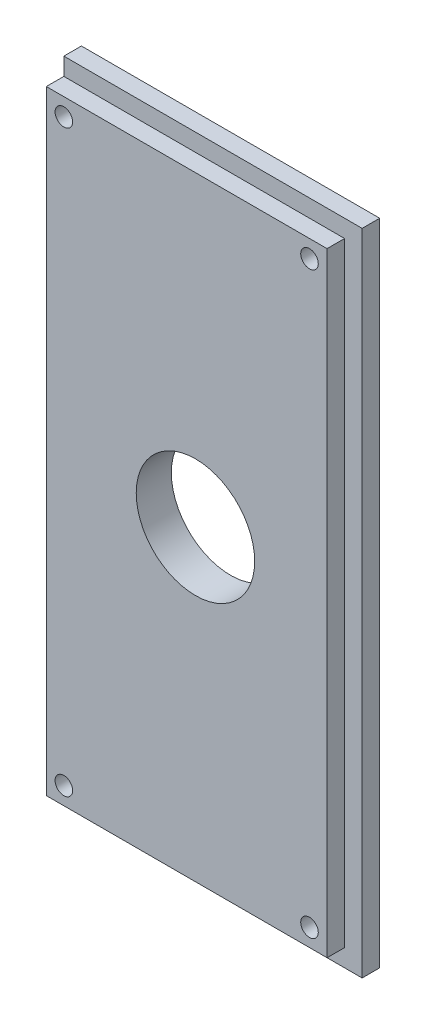
ISO-10303-21;
HEADER;
FILE_DESCRIPTION(('STEP AP214'),'2;1');
FILE_NAME('part.step','',(''),(''),'','','');
FILE_SCHEMA(('AUTOMOTIVE_DESIGN { 1 0 10303 214 1 1 1 1 }'));
ENDSEC;
DATA;
#1=APPLICATION_CONTEXT('core data for automotive mechanical design processes');
#2=APPLICATION_PROTOCOL_DEFINITION('international standard','automotive_design',2000,#1);
#3=PRODUCT_CONTEXT('',#1,'mechanical');
#4=PRODUCT('Part','Part','',(#3));
#5=PRODUCT_RELATED_PRODUCT_CATEGORY('part','',(#4));
#6=PRODUCT_DEFINITION_FORMATION('','',#4);
#7=PRODUCT_DEFINITION_CONTEXT('part definition',#1,'design');
#8=PRODUCT_DEFINITION('design','',#6,#7);
#9=PRODUCT_DEFINITION_SHAPE('','',#8);
#10=(LENGTH_UNIT() NAMED_UNIT(*) SI_UNIT(.MILLI.,.METRE.));
#11=(NAMED_UNIT(*) PLANE_ANGLE_UNIT() SI_UNIT($,.RADIAN.));
#12=(NAMED_UNIT(*) SI_UNIT($,.STERADIAN.) SOLID_ANGLE_UNIT());
#13=UNCERTAINTY_MEASURE_WITH_UNIT(LENGTH_MEASURE(1.E-05),#10,'distance_accuracy_value','');
#14=(GEOMETRIC_REPRESENTATION_CONTEXT(3) GLOBAL_UNCERTAINTY_ASSIGNED_CONTEXT((#13)) GLOBAL_UNIT_ASSIGNED_CONTEXT((#10,
#11,#12)) REPRESENTATION_CONTEXT('',''));
#15=CARTESIAN_POINT('',(0.,0.,0.));
#16=DIRECTION('',(0.,0.,1.));
#17=DIRECTION('',(1.,0.,0.));
#18=AXIS2_PLACEMENT_3D('',#15,#16,#17);
#19=CARTESIAN_POINT('',(0.,0.,0.));
#20=DIRECTION('',(0.,0.,1.));
#21=DIRECTION('',(1.,0.,0.));
#22=AXIS2_PLACEMENT_3D('',#19,#20,#21);
#23=PLANE('',#22);
#24=CARTESIAN_POINT('',(0.,0.,0.));
#25=DIRECTION('',(0.,0.,-1.));
#26=DIRECTION('',(-1.,0.,0.));
#27=AXIS2_PLACEMENT_3D('',#24,#25,#26);
#28=CIRCLE('',#27,6.75);
#29=CARTESIAN_POINT('',(-6.75,0.,0.));
#30=VERTEX_POINT('',#29);
#31=EDGE_CURVE('E214',#30,#30,#28,.T.);
#32=ORIENTED_EDGE('',*,*,#31,.F.);
#33=EDGE_LOOP('',(#32));
#34=FACE_BOUND('',#33,.T.);
#35=CARTESIAN_POINT('',(-15.,33.,0.));
#36=DIRECTION('',(0.,0.,1.));
#37=DIRECTION('',(1.,0.,0.));
#38=AXIS2_PLACEMENT_3D('',#35,#36,#37);
#39=CIRCLE('',#38,1.);
#40=CARTESIAN_POINT('',(-14.,33.,0.));
#41=VERTEX_POINT('',#40);
#42=EDGE_CURVE('E211',#41,#41,#39,.T.);
#43=ORIENTED_EDGE('',*,*,#42,.T.);
#44=EDGE_LOOP('',(#43));
#45=FACE_BOUND('',#44,.T.);
#46=CARTESIAN_POINT('',(13.,33.,0.));
#47=DIRECTION('',(0.,0.,1.));
#48=DIRECTION('',(1.,0.,0.));
#49=AXIS2_PLACEMENT_3D('',#46,#47,#48);
#50=CIRCLE('',#49,1.);
#51=CARTESIAN_POINT('',(14.,33.,0.));
#52=VERTEX_POINT('',#51);
#53=EDGE_CURVE('E193',#52,#52,#50,.T.);
#54=ORIENTED_EDGE('',*,*,#53,.T.);
#55=EDGE_LOOP('',(#54));
#56=FACE_BOUND('',#55,.T.);
#57=CARTESIAN_POINT('',(13.,-33.,0.));
#58=DIRECTION('',(0.,0.,1.));
#59=DIRECTION('',(1.,0.,0.));
#60=AXIS2_PLACEMENT_3D('',#57,#58,#59);
#61=CIRCLE('',#60,1.);
#62=CARTESIAN_POINT('',(14.,-33.,0.));
#63=VERTEX_POINT('',#62);
#64=EDGE_CURVE('E200',#63,#63,#61,.T.);
#65=ORIENTED_EDGE('',*,*,#64,.T.);
#66=EDGE_LOOP('',(#65));
#67=FACE_BOUND('',#66,.T.);
#68=CARTESIAN_POINT('',(-15.,-33.,0.));
#69=DIRECTION('',(0.,0.,1.));
#70=DIRECTION('',(1.,0.,0.));
#71=AXIS2_PLACEMENT_3D('',#68,#69,#70);
#72=CIRCLE('',#71,1.);
#73=CARTESIAN_POINT('',(-14.,-33.,0.));
#74=VERTEX_POINT('',#73);
#75=EDGE_CURVE('E206',#74,#74,#72,.T.);
#76=ORIENTED_EDGE('',*,*,#75,.T.);
#77=EDGE_LOOP('',(#76));
#78=FACE_BOUND('',#77,.T.);
#79=DIRECTION('',(0.,-1.,0.));
#80=VECTOR('',#79,1.);
#81=CARTESIAN_POINT('',(-17.,37.,0.));
#82=LINE('',#81,#80);
#83=CARTESIAN_POINT('',(-17.,-7.,0.));
#84=VERTEX_POINT('',#83);
#85=CARTESIAN_POINT('',(-17.,-37.,0.));
#86=VERTEX_POINT('',#85);
#87=EDGE_CURVE('E305',#84,#86,#82,.T.);
#88=ORIENTED_EDGE('',*,*,#87,.F.);
#89=DIRECTION('',(-1.,0.,0.));
#90=VECTOR('',#89,1.);
#91=CARTESIAN_POINT('',(-11.,-7.,0.));
#92=LINE('',#91,#90);
#93=CARTESIAN_POINT('',(-9.,-7.,0.));
#94=VERTEX_POINT('',#93);
#95=EDGE_CURVE('E57',#84,#94,#92,.F.);
#96=ORIENTED_EDGE('',*,*,#95,.T.);
#97=DIRECTION('',(0.,-1.,0.));
#98=VECTOR('',#97,1.);
#99=CARTESIAN_POINT('',(-9.,5.,0.));
#100=LINE('',#99,#98);
#101=CARTESIAN_POINT('',(-9.,7.,0.));
#102=VERTEX_POINT('',#101);
#103=EDGE_CURVE('E274',#94,#102,#100,.F.);
#104=ORIENTED_EDGE('',*,*,#103,.T.);
#105=DIRECTION('',(1.,0.,0.));
#106=VECTOR('',#105,1.);
#107=CARTESIAN_POINT('',(-17.,7.,0.));
#108=LINE('',#107,#106);
#109=CARTESIAN_POINT('',(-17.,7.,0.));
#110=VERTEX_POINT('',#109);
#111=EDGE_CURVE('E171',#102,#110,#108,.F.);
#112=ORIENTED_EDGE('',*,*,#111,.T.);
#113=CARTESIAN_POINT('',(-17.,37.,0.));
#114=VERTEX_POINT('',#113);
#115=EDGE_CURVE('E304',#114,#110,#82,.T.);
#116=ORIENTED_EDGE('',*,*,#115,.F.);
#117=DIRECTION('',(-1.,0.,0.));
#118=VECTOR('',#117,1.);
#119=CARTESIAN_POINT('',(-17.,37.,0.));
#120=LINE('',#119,#118);
#121=CARTESIAN_POINT('',(17.,37.,0.));
#122=VERTEX_POINT('',#121);
#123=EDGE_CURVE('E317',#122,#114,#120,.T.);
#124=ORIENTED_EDGE('',*,*,#123,.F.);
#125=DIRECTION('',(0.,1.,0.));
#126=VECTOR('',#125,1.);
#127=CARTESIAN_POINT('',(17.,37.,0.));
#128=LINE('',#127,#126);
#129=CARTESIAN_POINT('',(17.,-37.,0.));
#130=VERTEX_POINT('',#129);
#131=EDGE_CURVE('E315',#130,#122,#128,.T.);
#132=ORIENTED_EDGE('',*,*,#131,.F.);
#133=DIRECTION('',(1.,0.,0.));
#134=VECTOR('',#133,1.);
#135=CARTESIAN_POINT('',(-17.,-37.,0.));
#136=LINE('',#135,#134);
#137=EDGE_CURVE('E308',#86,#130,#136,.T.);
#138=ORIENTED_EDGE('',*,*,#137,.F.);
#139=EDGE_LOOP('',(#88,#96,#104,#112,#116,#124,#132,#138));
#140=FACE_BOUND('',#139,.T.);
#141=ADVANCED_FACE('F33',(#34,#45,#56,#67,#78,#140),#23,.F.);
#142=CARTESIAN_POINT('',(-17.,37.,2.));
#143=DIRECTION('',(1.,0.,0.));
#144=DIRECTION('',(0.,1.,0.));
#145=AXIS2_PLACEMENT_3D('',#142,#143,#144);
#146=PLANE('',#145);
#147=ORIENTED_EDGE('',*,*,#115,.T.);
#148=CARTESIAN_POINT('',(-17.,7.,-2.));
#149=DIRECTION('',(1.,0.,0.));
#150=DIRECTION('',(0.,1.,0.));
#151=AXIS2_PLACEMENT_3D('',#148,#149,#150);
#152=CIRCLE('',#151,2.);
#153=CARTESIAN_POINT('',(-17.,5.,-2.));
#154=VERTEX_POINT('',#153);
#155=EDGE_CURVE('E11',#110,#154,#152,.T.);
#156=ORIENTED_EDGE('',*,*,#155,.T.);
#157=DIRECTION('',(0.,0.,-1.));
#158=VECTOR('',#157,1.);
#159=CARTESIAN_POINT('',(-17.,5.,2.));
#160=LINE('',#159,#158);
#161=CARTESIAN_POINT('',(-17.,5.,0.));
#162=VERTEX_POINT('',#161);
#163=EDGE_CURVE('E49',#162,#154,#160,.T.);
#164=ORIENTED_EDGE('',*,*,#163,.F.);
#165=CARTESIAN_POINT('',(-17.,-5.,0.));
#166=VERTEX_POINT('',#165);
#167=EDGE_CURVE('E303',#162,#166,#82,.T.);
#168=ORIENTED_EDGE('',*,*,#167,.T.);
#169=DIRECTION('',(0.,0.,1.));
#170=VECTOR('',#169,1.);
#171=CARTESIAN_POINT('',(-17.,-5.,2.));
#172=LINE('',#171,#170);
#173=CARTESIAN_POINT('',(-17.,-5.,-2.));
#174=VERTEX_POINT('',#173);
#175=EDGE_CURVE('E269',#174,#166,#172,.T.);
#176=ORIENTED_EDGE('',*,*,#175,.F.);
#177=CARTESIAN_POINT('',(-17.,-7.,-2.));
#178=DIRECTION('',(1.,0.,0.));
#179=DIRECTION('',(0.,1.,0.));
#180=AXIS2_PLACEMENT_3D('',#177,#178,#179);
#181=CIRCLE('',#180,2.);
#182=EDGE_CURVE('E42',#174,#84,#181,.T.);
#183=ORIENTED_EDGE('',*,*,#182,.T.);
#184=ORIENTED_EDGE('',*,*,#87,.T.);
#185=DIRECTION('',(0.,0.,-1.));
#186=VECTOR('',#185,1.);
#187=CARTESIAN_POINT('',(-17.,-37.,2.));
#188=LINE('',#187,#186);
#189=CARTESIAN_POINT('',(-17.,-37.,2.));
#190=VERTEX_POINT('',#189);
#191=EDGE_CURVE('E253',#190,#86,#188,.T.);
#192=ORIENTED_EDGE('',*,*,#191,.F.);
#193=DIRECTION('',(0.,-1.,0.));
#194=VECTOR('',#193,1.);
#195=CARTESIAN_POINT('',(-17.,37.,2.));
#196=LINE('',#195,#194);
#197=CARTESIAN_POINT('',(-17.,-35.,2.));
#198=VERTEX_POINT('',#197);
#199=EDGE_CURVE('E319',#198,#190,#196,.T.);
#200=ORIENTED_EDGE('',*,*,#199,.F.);
#201=DIRECTION('',(0.,0.,-1.));
#202=VECTOR('',#201,1.);
#203=CARTESIAN_POINT('',(-17.,-35.,4.));
#204=LINE('',#203,#202);
#205=CARTESIAN_POINT('',(-17.,-35.,4.));
#206=VERTEX_POINT('',#205);
#207=EDGE_CURVE('E309',#206,#198,#204,.T.);
#208=ORIENTED_EDGE('',*,*,#207,.F.);
#209=DIRECTION('',(0.,-1.,0.));
#210=VECTOR('',#209,1.);
#211=CARTESIAN_POINT('',(-17.,35.,4.));
#212=LINE('',#211,#210);
#213=CARTESIAN_POINT('',(-17.,35.,4.));
#214=VERTEX_POINT('',#213);
#215=EDGE_CURVE('E220',#214,#206,#212,.T.);
#216=ORIENTED_EDGE('',*,*,#215,.F.);
#217=DIRECTION('',(0.,0.,-1.));
#218=VECTOR('',#217,1.);
#219=CARTESIAN_POINT('',(-17.,35.,4.));
#220=LINE('',#219,#218);
#221=CARTESIAN_POINT('',(-17.,35.,2.));
#222=VERTEX_POINT('',#221);
#223=EDGE_CURVE('E230',#214,#222,#220,.T.);
#224=ORIENTED_EDGE('',*,*,#223,.T.);
#225=CARTESIAN_POINT('',(-17.,37.,2.));
#226=VERTEX_POINT('',#225);
#227=EDGE_CURVE('E331',#226,#222,#196,.T.);
#228=ORIENTED_EDGE('',*,*,#227,.F.);
#229=DIRECTION('',(0.,0.,-1.));
#230=VECTOR('',#229,1.);
#231=CARTESIAN_POINT('',(-17.,37.,2.));
#232=LINE('',#231,#230);
#233=EDGE_CURVE('E320',#226,#114,#232,.T.);
#234=ORIENTED_EDGE('',*,*,#233,.T.);
#235=EDGE_LOOP('',(#147,#156,#164,#168,#176,#183,#184,#192,#200,#208,#216,#224,#228,#234));
#236=FACE_BOUND('',#235,.T.);
#237=ADVANCED_FACE('F352',(#236),#146,.F.);
#238=CARTESIAN_POINT('',(-17.,-37.,2.));
#239=DIRECTION('',(0.,1.,0.));
#240=DIRECTION('',(0.,0.,1.));
#241=AXIS2_PLACEMENT_3D('',#238,#239,#240);
#242=PLANE('',#241);
#243=ORIENTED_EDGE('',*,*,#137,.T.);
#244=DIRECTION('',(0.,0.,-1.));
#245=VECTOR('',#244,1.);
#246=CARTESIAN_POINT('',(17.,-37.,2.));
#247=LINE('',#246,#245);
#248=CARTESIAN_POINT('',(17.,-37.,2.));
#249=VERTEX_POINT('',#248);
#250=EDGE_CURVE('E326',#249,#130,#247,.T.);
#251=ORIENTED_EDGE('',*,*,#250,.F.);
#252=DIRECTION('',(1.,0.,0.));
#253=VECTOR('',#252,1.);
#254=CARTESIAN_POINT('',(-17.,-37.,2.));
#255=LINE('',#254,#253);
#256=EDGE_CURVE('E334',#190,#249,#255,.T.);
#257=ORIENTED_EDGE('',*,*,#256,.F.);
#258=ORIENTED_EDGE('',*,*,#191,.T.);
#259=EDGE_LOOP('',(#243,#251,#257,#258));
#260=FACE_BOUND('',#259,.T.);
#261=ADVANCED_FACE('F377',(#260),#242,.F.);
#262=CARTESIAN_POINT('',(17.,37.,2.));
#263=DIRECTION('',(-1.,0.,0.));
#264=DIRECTION('',(0.,0.,1.));
#265=AXIS2_PLACEMENT_3D('',#262,#263,#264);
#266=PLANE('',#265);
#267=ORIENTED_EDGE('',*,*,#131,.T.);
#268=DIRECTION('',(0.,0.,-1.));
#269=VECTOR('',#268,1.);
#270=CARTESIAN_POINT('',(17.,37.,2.));
#271=LINE('',#270,#269);
#272=CARTESIAN_POINT('',(17.,37.,2.));
#273=VERTEX_POINT('',#272);
#274=EDGE_CURVE('E323',#273,#122,#271,.T.);
#275=ORIENTED_EDGE('',*,*,#274,.F.);
#276=DIRECTION('',(0.,1.,0.));
#277=VECTOR('',#276,1.);
#278=CARTESIAN_POINT('',(17.,37.,2.));
#279=LINE('',#278,#277);
#280=EDGE_CURVE('E340',#249,#273,#279,.T.);
#281=ORIENTED_EDGE('',*,*,#280,.F.);
#282=ORIENTED_EDGE('',*,*,#250,.T.);
#283=EDGE_LOOP('',(#267,#275,#281,#282));
#284=FACE_BOUND('',#283,.T.);
#285=ADVANCED_FACE('F381',(#284),#266,.F.);
#286=CARTESIAN_POINT('',(-17.,37.,2.));
#287=DIRECTION('',(0.,-1.,0.));
#288=DIRECTION('',(0.,0.,-1.));
#289=AXIS2_PLACEMENT_3D('',#286,#287,#288);
#290=PLANE('',#289);
#291=ORIENTED_EDGE('',*,*,#123,.T.);
#292=ORIENTED_EDGE('',*,*,#233,.F.);
#293=DIRECTION('',(-1.,0.,0.));
#294=VECTOR('',#293,1.);
#295=CARTESIAN_POINT('',(-17.,37.,2.));
#296=LINE('',#295,#294);
#297=EDGE_CURVE('E312',#273,#226,#296,.T.);
#298=ORIENTED_EDGE('',*,*,#297,.F.);
#299=ORIENTED_EDGE('',*,*,#274,.T.);
#300=EDGE_LOOP('',(#291,#292,#298,#299));
#301=FACE_BOUND('',#300,.T.);
#302=ADVANCED_FACE('F349',(#301),#290,.F.);
#303=CARTESIAN_POINT('',(0.,0.,2.));
#304=DIRECTION('',(0.,0.,1.));
#305=DIRECTION('',(1.,0.,0.));
#306=AXIS2_PLACEMENT_3D('',#303,#304,#305);
#307=PLANE('',#306);
#308=DIRECTION('',(-1.,0.,0.));
#309=VECTOR('',#308,1.);
#310=CARTESIAN_POINT('',(-17.,35.,2.));
#311=LINE('',#310,#309);
#312=CARTESIAN_POINT('',(15.,35.,2.));
#313=VERTEX_POINT('',#312);
#314=EDGE_CURVE('E224',#313,#222,#311,.T.);
#315=ORIENTED_EDGE('',*,*,#314,.F.);
#316=DIRECTION('',(0.,1.,0.));
#317=VECTOR('',#316,1.);
#318=CARTESIAN_POINT('',(15.,35.,2.));
#319=LINE('',#318,#317);
#320=CARTESIAN_POINT('',(15.,-35.,2.));
#321=VERTEX_POINT('',#320);
#322=EDGE_CURVE('E231',#321,#313,#319,.T.);
#323=ORIENTED_EDGE('',*,*,#322,.F.);
#324=DIRECTION('',(1.,0.,0.));
#325=VECTOR('',#324,1.);
#326=CARTESIAN_POINT('',(-17.,-35.,2.));
#327=LINE('',#326,#325);
#328=EDGE_CURVE('E234',#198,#321,#327,.T.);
#329=ORIENTED_EDGE('',*,*,#328,.F.);
#330=ORIENTED_EDGE('',*,*,#199,.T.);
#331=ORIENTED_EDGE('',*,*,#256,.T.);
#332=ORIENTED_EDGE('',*,*,#280,.T.);
#333=ORIENTED_EDGE('',*,*,#297,.T.);
#334=ORIENTED_EDGE('',*,*,#227,.T.);
#335=EDGE_LOOP('',(#315,#323,#329,#330,#331,#332,#333,#334));
#336=FACE_BOUND('',#335,.T.);
#337=ADVANCED_FACE('F346',(#336),#307,.T.);
#338=CARTESIAN_POINT('',(-17.,-35.,4.));
#339=DIRECTION('',(0.,1.,0.));
#340=DIRECTION('',(0.,0.,1.));
#341=AXIS2_PLACEMENT_3D('',#338,#339,#340);
#342=PLANE('',#341);
#343=ORIENTED_EDGE('',*,*,#328,.T.);
#344=DIRECTION('',(0.,0.,-1.));
#345=VECTOR('',#344,1.);
#346=CARTESIAN_POINT('',(15.,-35.,4.));
#347=LINE('',#346,#345);
#348=CARTESIAN_POINT('',(15.,-35.,4.));
#349=VERTEX_POINT('',#348);
#350=EDGE_CURVE('E338',#349,#321,#347,.T.);
#351=ORIENTED_EDGE('',*,*,#350,.F.);
#352=DIRECTION('',(1.,0.,0.));
#353=VECTOR('',#352,1.);
#354=CARTESIAN_POINT('',(-17.,-35.,4.));
#355=LINE('',#354,#353);
#356=EDGE_CURVE('E223',#206,#349,#355,.T.);
#357=ORIENTED_EDGE('',*,*,#356,.F.);
#358=ORIENTED_EDGE('',*,*,#207,.T.);
#359=EDGE_LOOP('',(#343,#351,#357,#358));
#360=FACE_BOUND('',#359,.T.);
#361=ADVANCED_FACE('F371',(#360),#342,.F.);
#362=CARTESIAN_POINT('',(15.,35.,4.));
#363=DIRECTION('',(-1.,0.,0.));
#364=DIRECTION('',(0.,-1.,0.));
#365=AXIS2_PLACEMENT_3D('',#362,#363,#364);
#366=PLANE('',#365);
#367=ORIENTED_EDGE('',*,*,#322,.T.);
#368=DIRECTION('',(0.,0.,-1.));
#369=VECTOR('',#368,1.);
#370=CARTESIAN_POINT('',(15.,35.,4.));
#371=LINE('',#370,#369);
#372=CARTESIAN_POINT('',(15.,35.,4.));
#373=VERTEX_POINT('',#372);
#374=EDGE_CURVE('E237',#373,#313,#371,.T.);
#375=ORIENTED_EDGE('',*,*,#374,.F.);
#376=DIRECTION('',(0.,1.,0.));
#377=VECTOR('',#376,1.);
#378=CARTESIAN_POINT('',(15.,35.,4.));
#379=LINE('',#378,#377);
#380=EDGE_CURVE('E226',#349,#373,#379,.T.);
#381=ORIENTED_EDGE('',*,*,#380,.F.);
#382=ORIENTED_EDGE('',*,*,#350,.T.);
#383=EDGE_LOOP('',(#367,#375,#381,#382));
#384=FACE_BOUND('',#383,.T.);
#385=ADVANCED_FACE('F364',(#384),#366,.F.);
#386=CARTESIAN_POINT('',(-17.,35.,4.));
#387=DIRECTION('',(0.,-1.,0.));
#388=DIRECTION('',(0.,0.,-1.));
#389=AXIS2_PLACEMENT_3D('',#386,#387,#388);
#390=PLANE('',#389);
#391=ORIENTED_EDGE('',*,*,#314,.T.);
#392=ORIENTED_EDGE('',*,*,#223,.F.);
#393=DIRECTION('',(-1.,0.,0.));
#394=VECTOR('',#393,1.);
#395=CARTESIAN_POINT('',(-17.,35.,4.));
#396=LINE('',#395,#394);
#397=EDGE_CURVE('E228',#373,#214,#396,.T.);
#398=ORIENTED_EDGE('',*,*,#397,.F.);
#399=ORIENTED_EDGE('',*,*,#374,.T.);
#400=EDGE_LOOP('',(#391,#392,#398,#399));
#401=FACE_BOUND('',#400,.T.);
#402=ADVANCED_FACE('F358',(#401),#390,.F.);
#403=CARTESIAN_POINT('',(0.,0.,4.));
#404=DIRECTION('',(0.,0.,1.));
#405=DIRECTION('',(1.,0.,0.));
#406=AXIS2_PLACEMENT_3D('',#403,#404,#405);
#407=PLANE('',#406);
#408=CARTESIAN_POINT('',(-15.,-33.,4.));
#409=DIRECTION('',(0.,0.,1.));
#410=DIRECTION('',(1.,0.,0.));
#411=AXIS2_PLACEMENT_3D('',#408,#409,#410);
#412=CIRCLE('',#411,1.);
#413=CARTESIAN_POINT('',(-14.,-33.,4.));
#414=VERTEX_POINT('',#413);
#415=EDGE_CURVE('E185',#414,#414,#412,.T.);
#416=ORIENTED_EDGE('',*,*,#415,.F.);
#417=EDGE_LOOP('',(#416));
#418=FACE_BOUND('',#417,.T.);
#419=CARTESIAN_POINT('',(13.,-33.,4.));
#420=DIRECTION('',(0.,0.,1.));
#421=DIRECTION('',(1.,0.,0.));
#422=AXIS2_PLACEMENT_3D('',#419,#420,#421);
#423=CIRCLE('',#422,1.);
#424=CARTESIAN_POINT('',(14.,-33.,4.));
#425=VERTEX_POINT('',#424);
#426=EDGE_CURVE('E203',#425,#425,#423,.T.);
#427=ORIENTED_EDGE('',*,*,#426,.F.);
#428=EDGE_LOOP('',(#427));
#429=FACE_BOUND('',#428,.T.);
#430=CARTESIAN_POINT('',(13.,33.,4.));
#431=DIRECTION('',(0.,0.,1.));
#432=DIRECTION('',(1.,0.,0.));
#433=AXIS2_PLACEMENT_3D('',#430,#431,#432);
#434=CIRCLE('',#433,1.);
#435=CARTESIAN_POINT('',(14.,33.,4.));
#436=VERTEX_POINT('',#435);
#437=EDGE_CURVE('E197',#436,#436,#434,.T.);
#438=ORIENTED_EDGE('',*,*,#437,.F.);
#439=EDGE_LOOP('',(#438));
#440=FACE_BOUND('',#439,.T.);
#441=CARTESIAN_POINT('',(-15.,33.,4.));
#442=DIRECTION('',(0.,0.,1.));
#443=DIRECTION('',(1.,0.,0.));
#444=AXIS2_PLACEMENT_3D('',#441,#442,#443);
#445=CIRCLE('',#444,1.);
#446=CARTESIAN_POINT('',(-14.,33.,4.));
#447=VERTEX_POINT('',#446);
#448=EDGE_CURVE('E196',#447,#447,#445,.T.);
#449=ORIENTED_EDGE('',*,*,#448,.F.);
#450=EDGE_LOOP('',(#449));
#451=FACE_BOUND('',#450,.T.);
#452=CARTESIAN_POINT('',(0.,0.,4.));
#453=DIRECTION('',(0.,0.,1.));
#454=DIRECTION('',(1.,0.,0.));
#455=AXIS2_PLACEMENT_3D('',#452,#453,#454);
#456=CIRCLE('',#455,6.75);
#457=CARTESIAN_POINT('',(6.75,0.,4.));
#458=VERTEX_POINT('',#457);
#459=EDGE_CURVE('E219',#458,#458,#456,.T.);
#460=ORIENTED_EDGE('',*,*,#459,.F.);
#461=EDGE_LOOP('',(#460));
#462=FACE_BOUND('',#461,.T.);
#463=ORIENTED_EDGE('',*,*,#215,.T.);
#464=ORIENTED_EDGE('',*,*,#356,.T.);
#465=ORIENTED_EDGE('',*,*,#380,.T.);
#466=ORIENTED_EDGE('',*,*,#397,.T.);
#467=EDGE_LOOP('',(#463,#464,#465,#466));
#468=FACE_BOUND('',#467,.T.);
#469=ADVANCED_FACE('F491',(#418,#429,#440,#451,#462,#468),#407,.T.);
#470=CARTESIAN_POINT('',(0.,0.,4.000025));
#471=DIRECTION('',(0.,0.,-1.));
#472=DIRECTION('',(-1.,0.,0.));
#473=AXIS2_PLACEMENT_3D('',#470,#471,#472);
#474=CYLINDRICAL_SURFACE('',#473,6.75);
#475=ORIENTED_EDGE('',*,*,#459,.T.);
#476=EDGE_LOOP('',(#475));
#477=FACE_BOUND('',#476,.T.);
#478=ORIENTED_EDGE('',*,*,#31,.T.);
#479=EDGE_LOOP('',(#478));
#480=FACE_BOUND('',#479,.T.);
#481=ADVANCED_FACE('F482',(#477,#480),#474,.F.);
#482=CARTESIAN_POINT('',(-15.,33.,0.));
#483=DIRECTION('',(0.,0.,1.));
#484=DIRECTION('',(1.,0.,0.));
#485=AXIS2_PLACEMENT_3D('',#482,#483,#484);
#486=CYLINDRICAL_SURFACE('',#485,1.);
#487=ORIENTED_EDGE('',*,*,#42,.F.);
#488=EDGE_LOOP('',(#487));
#489=FACE_BOUND('',#488,.T.);
#490=ORIENTED_EDGE('',*,*,#448,.T.);
#491=EDGE_LOOP('',(#490));
#492=FACE_BOUND('',#491,.T.);
#493=ADVANCED_FACE('F474',(#489,#492),#486,.F.);
#494=CARTESIAN_POINT('',(13.,33.,0.));
#495=DIRECTION('',(0.,0.,1.));
#496=DIRECTION('',(1.,0.,0.));
#497=AXIS2_PLACEMENT_3D('',#494,#495,#496);
#498=CYLINDRICAL_SURFACE('',#497,1.);
#499=ORIENTED_EDGE('',*,*,#53,.F.);
#500=EDGE_LOOP('',(#499));
#501=FACE_BOUND('',#500,.T.);
#502=ORIENTED_EDGE('',*,*,#437,.T.);
#503=EDGE_LOOP('',(#502));
#504=FACE_BOUND('',#503,.T.);
#505=ADVANCED_FACE('F466',(#501,#504),#498,.F.);
#506=CARTESIAN_POINT('',(13.,-33.,0.));
#507=DIRECTION('',(0.,0.,1.));
#508=DIRECTION('',(1.,0.,0.));
#509=AXIS2_PLACEMENT_3D('',#506,#507,#508);
#510=CYLINDRICAL_SURFACE('',#509,1.);
#511=ORIENTED_EDGE('',*,*,#64,.F.);
#512=EDGE_LOOP('',(#511));
#513=FACE_BOUND('',#512,.T.);
#514=ORIENTED_EDGE('',*,*,#426,.T.);
#515=EDGE_LOOP('',(#514));
#516=FACE_BOUND('',#515,.T.);
#517=ADVANCED_FACE('F458',(#513,#516),#510,.F.);
#518=CARTESIAN_POINT('',(-15.,-33.,0.));
#519=DIRECTION('',(0.,0.,1.));
#520=DIRECTION('',(1.,0.,0.));
#521=AXIS2_PLACEMENT_3D('',#518,#519,#520);
#522=CYLINDRICAL_SURFACE('',#521,1.);
#523=ORIENTED_EDGE('',*,*,#75,.F.);
#524=EDGE_LOOP('',(#523));
#525=FACE_BOUND('',#524,.T.);
#526=ORIENTED_EDGE('',*,*,#415,.T.);
#527=EDGE_LOOP('',(#526));
#528=FACE_BOUND('',#527,.T.);
#529=ADVANCED_FACE('F450',(#525,#528),#522,.F.);
#530=CARTESIAN_POINT('',(0.,0.,0.));
#531=DIRECTION('',(0.,0.,1.));
#532=DIRECTION('',(1.,0.,0.));
#533=AXIS2_PLACEMENT_3D('',#530,#531,#532);
#534=PLANE('',#533);
#535=DIRECTION('',(1.,0.,0.));
#536=VECTOR('',#535,1.);
#537=CARTESIAN_POINT('',(-21.,5.,0.));
#538=LINE('',#537,#536);
#539=CARTESIAN_POINT('',(-19.,5.,0.));
#540=VERTEX_POINT('',#539);
#541=EDGE_CURVE('E188',#540,#162,#538,.T.);
#542=ORIENTED_EDGE('',*,*,#541,.F.);
#543=CARTESIAN_POINT('',(-19.,3.,0.));
#544=DIRECTION('',(0.,0.,1.));
#545=DIRECTION('',(1.,0.,0.));
#546=AXIS2_PLACEMENT_3D('',#543,#544,#545);
#547=CIRCLE('',#546,2.);
#548=CARTESIAN_POINT('',(-21.,3.,0.));
#549=VERTEX_POINT('',#548);
#550=EDGE_CURVE('E258',#540,#549,#547,.T.);
#551=ORIENTED_EDGE('',*,*,#550,.T.);
#552=DIRECTION('',(0.,1.,0.));
#553=VECTOR('',#552,1.);
#554=CARTESIAN_POINT('',(-21.,5.,0.));
#555=LINE('',#554,#553);
#556=CARTESIAN_POINT('',(-21.,-3.,0.));
#557=VERTEX_POINT('',#556);
#558=EDGE_CURVE('E173',#557,#549,#555,.T.);
#559=ORIENTED_EDGE('',*,*,#558,.F.);
#560=CARTESIAN_POINT('',(-19.,-3.,0.));
#561=DIRECTION('',(0.,0.,1.));
#562=DIRECTION('',(1.,0.,0.));
#563=AXIS2_PLACEMENT_3D('',#560,#561,#562);
#564=CIRCLE('',#563,2.);
#565=CARTESIAN_POINT('',(-19.,-5.,0.));
#566=VERTEX_POINT('',#565);
#567=EDGE_CURVE('E256',#557,#566,#564,.T.);
#568=ORIENTED_EDGE('',*,*,#567,.T.);
#569=DIRECTION('',(-1.,0.,0.));
#570=VECTOR('',#569,1.);
#571=CARTESIAN_POINT('',(-21.,-5.,0.));
#572=LINE('',#571,#570);
#573=EDGE_CURVE('E190',#166,#566,#572,.T.);
#574=ORIENTED_EDGE('',*,*,#573,.F.);
#575=ORIENTED_EDGE('',*,*,#167,.F.);
#576=EDGE_LOOP('',(#542,#551,#559,#568,#574,#575));
#577=FACE_BOUND('',#576,.T.);
#578=ADVANCED_FACE('F294',(#577),#534,.T.);
#579=CARTESIAN_POINT('',(-21.,5.,-2.));
#580=DIRECTION('',(1.,0.,0.));
#581=DIRECTION('',(0.,0.,-1.));
#582=AXIS2_PLACEMENT_3D('',#579,#580,#581);
#583=PLANE('',#582);
#584=ORIENTED_EDGE('',*,*,#558,.T.);
#585=DIRECTION('',(0.,0.,1.));
#586=VECTOR('',#585,1.);
#587=CARTESIAN_POINT('',(-21.,3.,-2.));
#588=LINE('',#587,#586);
#589=CARTESIAN_POINT('',(-21.,3.,-2.));
#590=VERTEX_POINT('',#589);
#591=EDGE_CURVE('E263',#549,#590,#588,.F.);
#592=ORIENTED_EDGE('',*,*,#591,.T.);
#593=DIRECTION('',(0.,1.,0.));
#594=VECTOR('',#593,1.);
#595=CARTESIAN_POINT('',(-21.,5.,-2.));
#596=LINE('',#595,#594);
#597=CARTESIAN_POINT('',(-21.,-3.,-2.));
#598=VERTEX_POINT('',#597);
#599=EDGE_CURVE('E167',#598,#590,#596,.T.);
#600=ORIENTED_EDGE('',*,*,#599,.F.);
#601=DIRECTION('',(0.,0.,1.));
#602=VECTOR('',#601,1.);
#603=CARTESIAN_POINT('',(-21.,-3.,-2.));
#604=LINE('',#603,#602);
#605=EDGE_CURVE('E260',#598,#557,#604,.T.);
#606=ORIENTED_EDGE('',*,*,#605,.T.);
#607=EDGE_LOOP('',(#584,#592,#600,#606));
#608=FACE_BOUND('',#607,.T.);
#609=ADVANCED_FACE('F290',(#608),#583,.F.);
#610=CARTESIAN_POINT('',(-21.,5.,-2.));
#611=DIRECTION('',(0.,-1.,0.));
#612=DIRECTION('',(1.,0.,0.));
#613=AXIS2_PLACEMENT_3D('',#610,#611,#612);
#614=PLANE('',#613);
#615=DIRECTION('',(1.,0.,0.));
#616=VECTOR('',#615,1.);
#617=CARTESIAN_POINT('',(-21.,5.,-2.));
#618=LINE('',#617,#616);
#619=CARTESIAN_POINT('',(-19.,5.,-2.));
#620=VERTEX_POINT('',#619);
#621=EDGE_CURVE('E164',#620,#154,#618,.T.);
#622=ORIENTED_EDGE('',*,*,#621,.F.);
#623=DIRECTION('',(0.,0.,1.));
#624=VECTOR('',#623,1.);
#625=CARTESIAN_POINT('',(-19.,5.,-2.));
#626=LINE('',#625,#624);
#627=EDGE_CURVE('E252',#620,#540,#626,.T.);
#628=ORIENTED_EDGE('',*,*,#627,.T.);
#629=ORIENTED_EDGE('',*,*,#541,.T.);
#630=ORIENTED_EDGE('',*,*,#163,.T.);
#631=EDGE_LOOP('',(#622,#628,#629,#630));
#632=FACE_BOUND('',#631,.T.);
#633=ADVANCED_FACE('F302',(#632),#614,.F.);
#634=CARTESIAN_POINT('',(-21.,-5.,-2.));
#635=DIRECTION('',(0.,1.,0.));
#636=DIRECTION('',(-1.,0.,0.));
#637=AXIS2_PLACEMENT_3D('',#634,#635,#636);
#638=PLANE('',#637);
#639=ORIENTED_EDGE('',*,*,#573,.T.);
#640=DIRECTION('',(0.,0.,1.));
#641=VECTOR('',#640,1.);
#642=CARTESIAN_POINT('',(-19.,-5.,-2.));
#643=LINE('',#642,#641);
#644=CARTESIAN_POINT('',(-19.,-5.,-2.));
#645=VERTEX_POINT('',#644);
#646=EDGE_CURVE('E271',#566,#645,#643,.F.);
#647=ORIENTED_EDGE('',*,*,#646,.T.);
#648=DIRECTION('',(-1.,0.,0.));
#649=VECTOR('',#648,1.);
#650=CARTESIAN_POINT('',(-21.,-5.,-2.));
#651=LINE('',#650,#649);
#652=EDGE_CURVE('E178',#174,#645,#651,.T.);
#653=ORIENTED_EDGE('',*,*,#652,.F.);
#654=ORIENTED_EDGE('',*,*,#175,.T.);
#655=EDGE_LOOP('',(#639,#647,#653,#654));
#656=FACE_BOUND('',#655,.T.);
#657=ADVANCED_FACE('F425',(#656),#638,.F.);
#658=CARTESIAN_POINT('',(0.,0.,-2.));
#659=DIRECTION('',(0.,0.,1.));
#660=DIRECTION('',(1.,0.,0.));
#661=AXIS2_PLACEMENT_3D('',#658,#659,#660);
#662=PLANE('',#661);
#663=ORIENTED_EDGE('',*,*,#599,.T.);
#664=CARTESIAN_POINT('',(-19.,3.,-2.));
#665=DIRECTION('',(0.,0.,1.));
#666=DIRECTION('',(1.,0.,0.));
#667=AXIS2_PLACEMENT_3D('',#664,#665,#666);
#668=CIRCLE('',#667,2.);
#669=EDGE_CURVE('E267',#590,#620,#668,.F.);
#670=ORIENTED_EDGE('',*,*,#669,.T.);
#671=ORIENTED_EDGE('',*,*,#621,.T.);
#672=CARTESIAN_POINT('',(-11.,5.,-2.));
#673=VERTEX_POINT('',#672);
#674=EDGE_CURVE('E155',#154,#673,#618,.T.);
#675=ORIENTED_EDGE('',*,*,#674,.T.);
#676=DIRECTION('',(0.,-1.,0.));
#677=VECTOR('',#676,1.);
#678=CARTESIAN_POINT('',(-11.,5.,-2.));
#679=LINE('',#678,#677);
#680=CARTESIAN_POINT('',(-11.,-5.,-2.));
#681=VERTEX_POINT('',#680);
#682=EDGE_CURVE('E161',#673,#681,#679,.T.);
#683=ORIENTED_EDGE('',*,*,#682,.T.);
#684=EDGE_CURVE('E181',#681,#174,#651,.T.);
#685=ORIENTED_EDGE('',*,*,#684,.T.);
#686=ORIENTED_EDGE('',*,*,#652,.T.);
#687=CARTESIAN_POINT('',(-19.,-3.,-2.));
#688=DIRECTION('',(0.,0.,1.));
#689=DIRECTION('',(1.,0.,0.));
#690=AXIS2_PLACEMENT_3D('',#687,#688,#689);
#691=CIRCLE('',#690,2.);
#692=EDGE_CURVE('E265',#645,#598,#691,.F.);
#693=ORIENTED_EDGE('',*,*,#692,.T.);
#694=EDGE_LOOP('',(#663,#670,#671,#675,#683,#685,#686,#693));
#695=FACE_BOUND('',#694,.T.);
#696=ADVANCED_FACE('F158',(#695),#662,.F.);
#697=CARTESIAN_POINT('',(-19.,3.,-2.));
#698=DIRECTION('',(0.,0.,1.));
#699=DIRECTION('',(1.,0.,0.));
#700=AXIS2_PLACEMENT_3D('',#697,#698,#699);
#701=CYLINDRICAL_SURFACE('',#700,2.);
#702=ORIENTED_EDGE('',*,*,#669,.F.);
#703=ORIENTED_EDGE('',*,*,#591,.F.);
#704=ORIENTED_EDGE('',*,*,#550,.F.);
#705=ORIENTED_EDGE('',*,*,#627,.F.);
#706=EDGE_LOOP('',(#702,#703,#704,#705));
#707=FACE_BOUND('',#706,.T.);
#708=ADVANCED_FACE('F300',(#707),#701,.T.);
#709=CARTESIAN_POINT('',(-19.,-3.,-2.));
#710=DIRECTION('',(0.,0.,1.));
#711=DIRECTION('',(1.,0.,0.));
#712=AXIS2_PLACEMENT_3D('',#709,#710,#711);
#713=CYLINDRICAL_SURFACE('',#712,2.);
#714=ORIENTED_EDGE('',*,*,#692,.F.);
#715=ORIENTED_EDGE('',*,*,#646,.F.);
#716=ORIENTED_EDGE('',*,*,#567,.F.);
#717=ORIENTED_EDGE('',*,*,#605,.F.);
#718=EDGE_LOOP('',(#714,#715,#716,#717));
#719=FACE_BOUND('',#718,.T.);
#720=ADVANCED_FACE('F287',(#719),#713,.T.);
#721=CARTESIAN_POINT('',(-21.,7.,-2.));
#722=DIRECTION('',(-1.,0.,0.));
#723=DIRECTION('',(0.,-1.,0.));
#724=AXIS2_PLACEMENT_3D('',#721,#722,#723);
#725=CYLINDRICAL_SURFACE('',#724,2.);
#726=ORIENTED_EDGE('',*,*,#155,.F.);
#727=ORIENTED_EDGE('',*,*,#111,.F.);
#728=CARTESIAN_POINT('',(-9.,7.,-2.));
#729=DIRECTION('',(-0.707106781186547,0.707106781186547,0.));
#730=DIRECTION('',(-0.707106781186548,-0.707106781186547,0.));
#731=AXIS2_PLACEMENT_3D('',#728,#729,#730);
#732=ELLIPSE('',#731,2.82842712474619,2.);
#733=EDGE_CURVE('E37',#673,#102,#732,.T.);
#734=ORIENTED_EDGE('',*,*,#733,.F.);
#735=ORIENTED_EDGE('',*,*,#674,.F.);
#736=EDGE_LOOP('',(#726,#727,#734,#735));
#737=FACE_BOUND('',#736,.T.);
#738=ADVANCED_FACE('F35',(#737),#725,.F.);
#739=CARTESIAN_POINT('',(-9.,5.,-2.));
#740=DIRECTION('',(0.,1.,0.));
#741=DIRECTION('',(0.,0.,1.));
#742=AXIS2_PLACEMENT_3D('',#739,#740,#741);
#743=CYLINDRICAL_SURFACE('',#742,2.);
#744=ORIENTED_EDGE('',*,*,#733,.T.);
#745=ORIENTED_EDGE('',*,*,#103,.F.);
#746=CARTESIAN_POINT('',(-9.,-7.,-2.));
#747=DIRECTION('',(0.707106781186547,0.707106781186547,0.));
#748=DIRECTION('',(-0.707106781186548,0.707106781186547,0.));
#749=AXIS2_PLACEMENT_3D('',#746,#747,#748);
#750=ELLIPSE('',#749,2.82842712474619,2.);
#751=EDGE_CURVE('E174',#681,#94,#750,.T.);
#752=ORIENTED_EDGE('',*,*,#751,.F.);
#753=ORIENTED_EDGE('',*,*,#682,.F.);
#754=EDGE_LOOP('',(#744,#745,#752,#753));
#755=FACE_BOUND('',#754,.T.);
#756=ADVANCED_FACE('F175',(#755),#743,.F.);
#757=CARTESIAN_POINT('',(-21.,-7.,-2.));
#758=DIRECTION('',(1.,0.,0.));
#759=DIRECTION('',(0.,1.,0.));
#760=AXIS2_PLACEMENT_3D('',#757,#758,#759);
#761=CYLINDRICAL_SURFACE('',#760,2.);
#762=ORIENTED_EDGE('',*,*,#751,.T.);
#763=ORIENTED_EDGE('',*,*,#95,.F.);
#764=ORIENTED_EDGE('',*,*,#182,.F.);
#765=ORIENTED_EDGE('',*,*,#684,.F.);
#766=EDGE_LOOP('',(#762,#763,#764,#765));
#767=FACE_BOUND('',#766,.T.);
#768=ADVANCED_FACE('F278',(#767),#761,.F.);
#769=CLOSED_SHELL('',(#141,#237,#261,#285,#302,#337,#361,#385,#402,#469,#481,#493,#505,#517,
#529,#578,#609,#633,#657,#696,#708,#720,#738,#756,#768));
#770=MANIFOLD_SOLID_BREP('B2',#769);
#771=ADVANCED_BREP_SHAPE_REPRESENTATION('',(#18,#770),#14);
#772=SHAPE_DEFINITION_REPRESENTATION(#9,#771);
ENDSEC;
END-ISO-10303-21;
